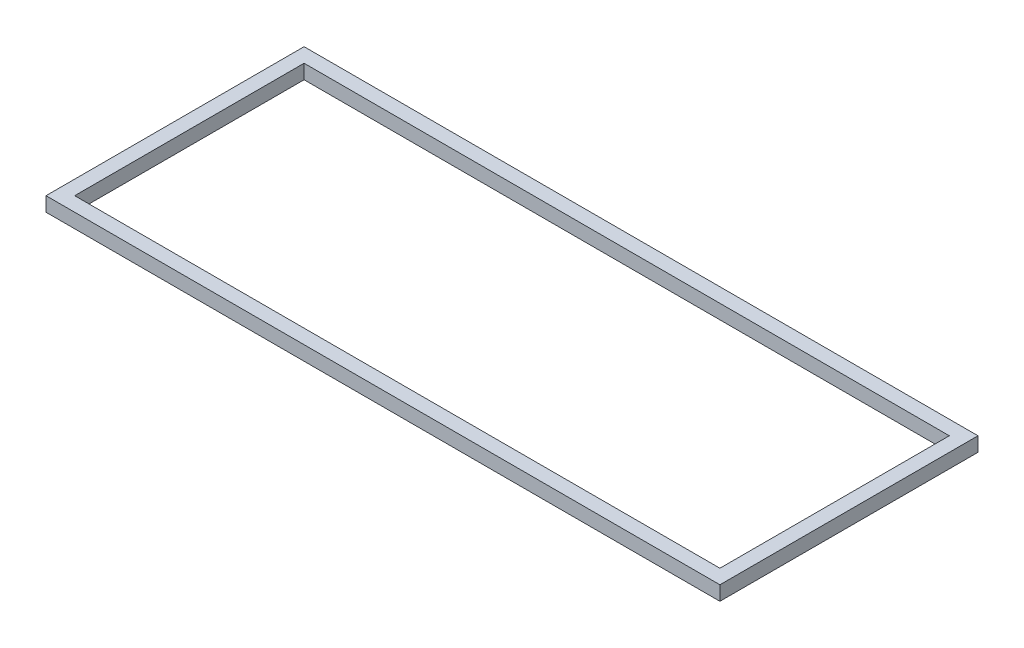
ISO-10303-21;
HEADER;
FILE_DESCRIPTION(('STEP AP214'),'2;1');
FILE_NAME('part.step','',(''),(''),'','','');
FILE_SCHEMA(('AUTOMOTIVE_DESIGN { 1 0 10303 214 1 1 1 1 }'));
ENDSEC;
DATA;
#1=APPLICATION_CONTEXT('core data for automotive mechanical design processes');
#2=APPLICATION_PROTOCOL_DEFINITION('international standard','automotive_design',2000,#1);
#3=PRODUCT_CONTEXT('',#1,'mechanical');
#4=PRODUCT('Part','Part','',(#3));
#5=PRODUCT_RELATED_PRODUCT_CATEGORY('part','',(#4));
#6=PRODUCT_DEFINITION_FORMATION('','',#4);
#7=PRODUCT_DEFINITION_CONTEXT('part definition',#1,'design');
#8=PRODUCT_DEFINITION('design','',#6,#7);
#9=PRODUCT_DEFINITION_SHAPE('','',#8);
#10=(LENGTH_UNIT() NAMED_UNIT(*) SI_UNIT(.MILLI.,.METRE.));
#11=(NAMED_UNIT(*) PLANE_ANGLE_UNIT() SI_UNIT($,.RADIAN.));
#12=(NAMED_UNIT(*) SI_UNIT($,.STERADIAN.) SOLID_ANGLE_UNIT());
#13=UNCERTAINTY_MEASURE_WITH_UNIT(LENGTH_MEASURE(1.E-05),#10,'distance_accuracy_value','');
#14=(GEOMETRIC_REPRESENTATION_CONTEXT(3) GLOBAL_UNCERTAINTY_ASSIGNED_CONTEXT((#13)) GLOBAL_UNIT_ASSIGNED_CONTEXT((#10,
#11,#12)) REPRESENTATION_CONTEXT('',''));
#15=CARTESIAN_POINT('',(0.,0.,0.));
#16=DIRECTION('',(0.,0.,1.));
#17=DIRECTION('',(1.,0.,0.));
#18=AXIS2_PLACEMENT_3D('',#15,#16,#17);
#19=CARTESIAN_POINT('',(0.,10.,0.));
#20=DIRECTION('',(0.,1.,0.));
#21=DIRECTION('',(0.,0.,1.));
#22=AXIS2_PLACEMENT_3D('',#19,#20,#21);
#23=PLANE('',#22);
#24=DIRECTION('',(0.,0.,1.));
#25=VECTOR('',#24,1.);
#26=CARTESIAN_POINT('',(-10.,10.,-10.));
#27=LINE('',#26,#25);
#28=CARTESIAN_POINT('',(-10.,10.,-10.));
#29=VERTEX_POINT('',#28);
#30=CARTESIAN_POINT('',(-9.99999999999998,10.,170.));
#31=VERTEX_POINT('',#30);
#32=EDGE_CURVE('E133',#29,#31,#27,.T.);
#33=ORIENTED_EDGE('',*,*,#32,.T.);
#34=DIRECTION('',(1.,0.,0.));
#35=VECTOR('',#34,1.);
#36=CARTESIAN_POINT('',(-9.99999999999998,10.,170.));
#37=LINE('',#36,#35);
#38=CARTESIAN_POINT('',(460.,10.,170.));
#39=VERTEX_POINT('',#38);
#40=EDGE_CURVE('E136',#31,#39,#37,.T.);
#41=ORIENTED_EDGE('',*,*,#40,.T.);
#42=DIRECTION('',(0.,0.,-1.));
#43=VECTOR('',#42,1.);
#44=CARTESIAN_POINT('',(460.,10.,-10.));
#45=LINE('',#44,#43);
#46=CARTESIAN_POINT('',(460.,10.,-10.));
#47=VERTEX_POINT('',#46);
#48=EDGE_CURVE('E139',#39,#47,#45,.T.);
#49=ORIENTED_EDGE('',*,*,#48,.T.);
#50=DIRECTION('',(-1.,0.,0.));
#51=VECTOR('',#50,1.);
#52=CARTESIAN_POINT('',(-10.,10.,-10.));
#53=LINE('',#52,#51);
#54=EDGE_CURVE('E141',#47,#29,#53,.T.);
#55=ORIENTED_EDGE('',*,*,#54,.T.);
#56=EDGE_LOOP('',(#33,#41,#49,#55));
#57=FACE_BOUND('',#56,.T.);
#58=DIRECTION('',(1.,0.,0.));
#59=VECTOR('',#58,1.);
#60=CARTESIAN_POINT('',(0.,10.,160.));
#61=LINE('',#60,#59);
#62=CARTESIAN_POINT('',(0.,10.,160.));
#63=VERTEX_POINT('',#62);
#64=CARTESIAN_POINT('',(450.,10.,160.));
#65=VERTEX_POINT('',#64);
#66=EDGE_CURVE('E105',#63,#65,#61,.T.);
#67=ORIENTED_EDGE('',*,*,#66,.F.);
#68=DIRECTION('',(0.,0.,1.));
#69=VECTOR('',#68,1.);
#70=CARTESIAN_POINT('',(0.,10.,0.));
#71=LINE('',#70,#69);
#72=CARTESIAN_POINT('',(0.,10.,0.));
#73=VERTEX_POINT('',#72);
#74=EDGE_CURVE('E97',#73,#63,#71,.T.);
#75=ORIENTED_EDGE('',*,*,#74,.F.);
#76=DIRECTION('',(-1.,0.,0.));
#77=VECTOR('',#76,1.);
#78=CARTESIAN_POINT('',(0.,10.,0.));
#79=LINE('',#78,#77);
#80=CARTESIAN_POINT('',(450.,10.,0.));
#81=VERTEX_POINT('',#80);
#82=EDGE_CURVE('E119',#81,#73,#79,.T.);
#83=ORIENTED_EDGE('',*,*,#82,.F.);
#84=DIRECTION('',(0.,0.,-1.));
#85=VECTOR('',#84,1.);
#86=CARTESIAN_POINT('',(450.,10.,0.));
#87=LINE('',#86,#85);
#88=EDGE_CURVE('E117',#65,#81,#87,.T.);
#89=ORIENTED_EDGE('',*,*,#88,.F.);
#90=EDGE_LOOP('',(#67,#75,#83,#89));
#91=FACE_BOUND('',#90,.T.);
#92=ADVANCED_FACE('F32',(#57,#91),#23,.T.);
#93=CARTESIAN_POINT('',(0.,0.,0.));
#94=DIRECTION('',(0.,1.,0.));
#95=DIRECTION('',(0.,0.,1.));
#96=AXIS2_PLACEMENT_3D('',#93,#94,#95);
#97=PLANE('',#96);
#98=DIRECTION('',(0.,0.,1.));
#99=VECTOR('',#98,1.);
#100=CARTESIAN_POINT('',(-10.,0.,-10.));
#101=LINE('',#100,#99);
#102=CARTESIAN_POINT('',(-10.,0.,-10.));
#103=VERTEX_POINT('',#102);
#104=CARTESIAN_POINT('',(-9.99999999999998,0.,170.));
#105=VERTEX_POINT('',#104);
#106=EDGE_CURVE('E113',#103,#105,#101,.T.);
#107=ORIENTED_EDGE('',*,*,#106,.F.);
#108=DIRECTION('',(-1.,0.,0.));
#109=VECTOR('',#108,1.);
#110=CARTESIAN_POINT('',(-10.,0.,-10.));
#111=LINE('',#110,#109);
#112=CARTESIAN_POINT('',(460.,0.,-10.));
#113=VERTEX_POINT('',#112);
#114=EDGE_CURVE('E137',#113,#103,#111,.T.);
#115=ORIENTED_EDGE('',*,*,#114,.F.);
#116=DIRECTION('',(0.,0.,-1.));
#117=VECTOR('',#116,1.);
#118=CARTESIAN_POINT('',(460.,0.,-10.));
#119=LINE('',#118,#117);
#120=CARTESIAN_POINT('',(460.,0.,170.));
#121=VERTEX_POINT('',#120);
#122=EDGE_CURVE('E148',#121,#113,#119,.T.);
#123=ORIENTED_EDGE('',*,*,#122,.F.);
#124=DIRECTION('',(1.,0.,0.));
#125=VECTOR('',#124,1.);
#126=CARTESIAN_POINT('',(-9.99999999999998,0.,170.));
#127=LINE('',#126,#125);
#128=EDGE_CURVE('E146',#105,#121,#127,.T.);
#129=ORIENTED_EDGE('',*,*,#128,.F.);
#130=EDGE_LOOP('',(#107,#115,#123,#129));
#131=FACE_BOUND('',#130,.T.);
#132=DIRECTION('',(0.,0.,1.));
#133=VECTOR('',#132,1.);
#134=CARTESIAN_POINT('',(0.,0.,0.));
#135=LINE('',#134,#133);
#136=CARTESIAN_POINT('',(0.,0.,0.));
#137=VERTEX_POINT('',#136);
#138=CARTESIAN_POINT('',(0.,0.,160.));
#139=VERTEX_POINT('',#138);
#140=EDGE_CURVE('E55',#137,#139,#135,.T.);
#141=ORIENTED_EDGE('',*,*,#140,.T.);
#142=DIRECTION('',(1.,0.,0.));
#143=VECTOR('',#142,1.);
#144=CARTESIAN_POINT('',(0.,0.,160.));
#145=LINE('',#144,#143);
#146=CARTESIAN_POINT('',(450.,0.,160.));
#147=VERTEX_POINT('',#146);
#148=EDGE_CURVE('E112',#139,#147,#145,.T.);
#149=ORIENTED_EDGE('',*,*,#148,.T.);
#150=DIRECTION('',(0.,0.,-1.));
#151=VECTOR('',#150,1.);
#152=CARTESIAN_POINT('',(450.,0.,0.));
#153=LINE('',#152,#151);
#154=CARTESIAN_POINT('',(450.,0.,0.));
#155=VERTEX_POINT('',#154);
#156=EDGE_CURVE('E125',#147,#155,#153,.T.);
#157=ORIENTED_EDGE('',*,*,#156,.T.);
#158=DIRECTION('',(-1.,0.,0.));
#159=VECTOR('',#158,1.);
#160=CARTESIAN_POINT('',(0.,0.,0.));
#161=LINE('',#160,#159);
#162=EDGE_CURVE('E106',#155,#137,#161,.T.);
#163=ORIENTED_EDGE('',*,*,#162,.T.);
#164=EDGE_LOOP('',(#141,#149,#157,#163));
#165=FACE_BOUND('',#164,.T.);
#166=ADVANCED_FACE('F166',(#131,#165),#97,.F.);
#167=CARTESIAN_POINT('',(-10.,10.,-10.));
#168=DIRECTION('',(1.,0.,0.));
#169=DIRECTION('',(0.,0.,-1.));
#170=AXIS2_PLACEMENT_3D('',#167,#168,#169);
#171=PLANE('',#170);
#172=ORIENTED_EDGE('',*,*,#106,.T.);
#173=DIRECTION('',(0.,-1.,0.));
#174=VECTOR('',#173,1.);
#175=CARTESIAN_POINT('',(-9.99999999999998,10.,170.));
#176=LINE('',#175,#174);
#177=EDGE_CURVE('E11',#31,#105,#176,.T.);
#178=ORIENTED_EDGE('',*,*,#177,.F.);
#179=ORIENTED_EDGE('',*,*,#32,.F.);
#180=DIRECTION('',(0.,-1.,0.));
#181=VECTOR('',#180,1.);
#182=CARTESIAN_POINT('',(-10.,10.,-10.));
#183=LINE('',#182,#181);
#184=EDGE_CURVE('E143',#29,#103,#183,.T.);
#185=ORIENTED_EDGE('',*,*,#184,.T.);
#186=EDGE_LOOP('',(#172,#178,#179,#185));
#187=FACE_BOUND('',#186,.T.);
#188=ADVANCED_FACE('F34',(#187),#171,.F.);
#189=CARTESIAN_POINT('',(-9.99999999999998,10.,170.));
#190=DIRECTION('',(0.,0.,-1.));
#191=DIRECTION('',(-1.,0.,0.));
#192=AXIS2_PLACEMENT_3D('',#189,#190,#191);
#193=PLANE('',#192);
#194=ORIENTED_EDGE('',*,*,#128,.T.);
#195=DIRECTION('',(0.,-1.,0.));
#196=VECTOR('',#195,1.);
#197=CARTESIAN_POINT('',(460.,10.,170.));
#198=LINE('',#197,#196);
#199=EDGE_CURVE('E40',#39,#121,#198,.T.);
#200=ORIENTED_EDGE('',*,*,#199,.F.);
#201=ORIENTED_EDGE('',*,*,#40,.F.);
#202=ORIENTED_EDGE('',*,*,#177,.T.);
#203=EDGE_LOOP('',(#194,#200,#201,#202));
#204=FACE_BOUND('',#203,.T.);
#205=ADVANCED_FACE('F176',(#204),#193,.F.);
#206=CARTESIAN_POINT('',(460.,10.,-10.));
#207=DIRECTION('',(-1.,0.,0.));
#208=DIRECTION('',(0.,0.,1.));
#209=AXIS2_PLACEMENT_3D('',#206,#207,#208);
#210=PLANE('',#209);
#211=ORIENTED_EDGE('',*,*,#122,.T.);
#212=DIRECTION('',(0.,-1.,0.));
#213=VECTOR('',#212,1.);
#214=CARTESIAN_POINT('',(460.,10.,-10.));
#215=LINE('',#214,#213);
#216=EDGE_CURVE('E153',#47,#113,#215,.T.);
#217=ORIENTED_EDGE('',*,*,#216,.F.);
#218=ORIENTED_EDGE('',*,*,#48,.F.);
#219=ORIENTED_EDGE('',*,*,#199,.T.);
#220=EDGE_LOOP('',(#211,#217,#218,#219));
#221=FACE_BOUND('',#220,.T.);
#222=ADVANCED_FACE('F160',(#221),#210,.F.);
#223=CARTESIAN_POINT('',(-10.,10.,-10.));
#224=DIRECTION('',(0.,0.,1.));
#225=DIRECTION('',(1.,0.,0.));
#226=AXIS2_PLACEMENT_3D('',#223,#224,#225);
#227=PLANE('',#226);
#228=ORIENTED_EDGE('',*,*,#114,.T.);
#229=ORIENTED_EDGE('',*,*,#184,.F.);
#230=ORIENTED_EDGE('',*,*,#54,.F.);
#231=ORIENTED_EDGE('',*,*,#216,.T.);
#232=EDGE_LOOP('',(#228,#229,#230,#231));
#233=FACE_BOUND('',#232,.T.);
#234=ADVANCED_FACE('F170',(#233),#227,.F.);
#235=CARTESIAN_POINT('',(0.,10.,0.));
#236=DIRECTION('',(1.,0.,0.));
#237=DIRECTION('',(0.,0.,-1.));
#238=AXIS2_PLACEMENT_3D('',#235,#236,#237);
#239=PLANE('',#238);
#240=ORIENTED_EDGE('',*,*,#140,.F.);
#241=DIRECTION('',(0.,-1.,0.));
#242=VECTOR('',#241,1.);
#243=CARTESIAN_POINT('',(0.,10.,0.));
#244=LINE('',#243,#242);
#245=EDGE_CURVE('E101',#73,#137,#244,.T.);
#246=ORIENTED_EDGE('',*,*,#245,.F.);
#247=ORIENTED_EDGE('',*,*,#74,.T.);
#248=DIRECTION('',(0.,-1.,0.));
#249=VECTOR('',#248,1.);
#250=CARTESIAN_POINT('',(0.,10.,160.));
#251=LINE('',#250,#249);
#252=EDGE_CURVE('E100',#63,#139,#251,.T.);
#253=ORIENTED_EDGE('',*,*,#252,.T.);
#254=EDGE_LOOP('',(#240,#246,#247,#253));
#255=FACE_BOUND('',#254,.T.);
#256=ADVANCED_FACE('F99',(#255),#239,.T.);
#257=CARTESIAN_POINT('',(0.,10.,160.));
#258=DIRECTION('',(0.,0.,-1.));
#259=DIRECTION('',(-1.,0.,0.));
#260=AXIS2_PLACEMENT_3D('',#257,#258,#259);
#261=PLANE('',#260);
#262=ORIENTED_EDGE('',*,*,#148,.F.);
#263=ORIENTED_EDGE('',*,*,#252,.F.);
#264=ORIENTED_EDGE('',*,*,#66,.T.);
#265=DIRECTION('',(0.,-1.,0.));
#266=VECTOR('',#265,1.);
#267=CARTESIAN_POINT('',(450.,10.,160.));
#268=LINE('',#267,#266);
#269=EDGE_CURVE('E114',#65,#147,#268,.T.);
#270=ORIENTED_EDGE('',*,*,#269,.T.);
#271=EDGE_LOOP('',(#262,#263,#264,#270));
#272=FACE_BOUND('',#271,.T.);
#273=ADVANCED_FACE('F109',(#272),#261,.T.);
#274=CARTESIAN_POINT('',(450.,10.,0.));
#275=DIRECTION('',(-1.,0.,0.));
#276=DIRECTION('',(0.,0.,1.));
#277=AXIS2_PLACEMENT_3D('',#274,#275,#276);
#278=PLANE('',#277);
#279=ORIENTED_EDGE('',*,*,#156,.F.);
#280=ORIENTED_EDGE('',*,*,#269,.F.);
#281=ORIENTED_EDGE('',*,*,#88,.T.);
#282=DIRECTION('',(0.,-1.,0.));
#283=VECTOR('',#282,1.);
#284=CARTESIAN_POINT('',(450.,10.,0.));
#285=LINE('',#284,#283);
#286=EDGE_CURVE('E47',#81,#155,#285,.T.);
#287=ORIENTED_EDGE('',*,*,#286,.T.);
#288=EDGE_LOOP('',(#279,#280,#281,#287));
#289=FACE_BOUND('',#288,.T.);
#290=ADVANCED_FACE('F199',(#289),#278,.T.);
#291=CARTESIAN_POINT('',(0.,10.,0.));
#292=DIRECTION('',(0.,0.,1.));
#293=DIRECTION('',(1.,0.,0.));
#294=AXIS2_PLACEMENT_3D('',#291,#292,#293);
#295=PLANE('',#294);
#296=ORIENTED_EDGE('',*,*,#162,.F.);
#297=ORIENTED_EDGE('',*,*,#286,.F.);
#298=ORIENTED_EDGE('',*,*,#82,.T.);
#299=ORIENTED_EDGE('',*,*,#245,.T.);
#300=EDGE_LOOP('',(#296,#297,#298,#299));
#301=FACE_BOUND('',#300,.T.);
#302=ADVANCED_FACE('F203',(#301),#295,.T.);
#303=CLOSED_SHELL('',(#92,#166,#188,#205,#222,#234,#256,#273,#290,#302));
#304=MANIFOLD_SOLID_BREP('B2',#303);
#305=ADVANCED_BREP_SHAPE_REPRESENTATION('',(#18,#304),#14);
#306=SHAPE_DEFINITION_REPRESENTATION(#9,#305);
ENDSEC;
END-ISO-10303-21;
